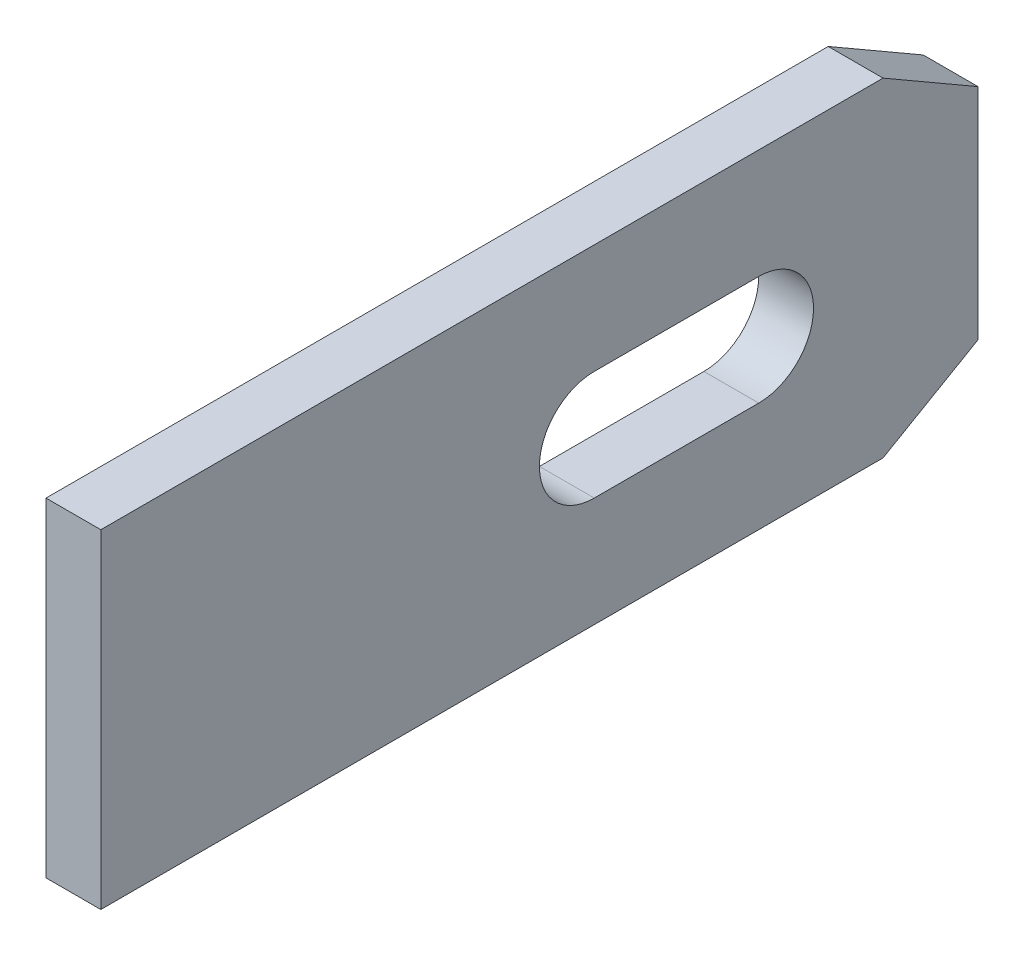
ISO-10303-21;
HEADER;
FILE_DESCRIPTION(('STEP AP214'),'2;1');
FILE_NAME('part.step','',(''),(''),'','','');
FILE_SCHEMA(('AUTOMOTIVE_DESIGN { 1 0 10303 214 1 1 1 1 }'));
ENDSEC;
DATA;
#1=APPLICATION_CONTEXT('core data for automotive mechanical design processes');
#2=APPLICATION_PROTOCOL_DEFINITION('international standard','automotive_design',2000,#1);
#3=PRODUCT_CONTEXT('',#1,'mechanical');
#4=PRODUCT('Part','Part','',(#3));
#5=PRODUCT_RELATED_PRODUCT_CATEGORY('part','',(#4));
#6=PRODUCT_DEFINITION_FORMATION('','',#4);
#7=PRODUCT_DEFINITION_CONTEXT('part definition',#1,'design');
#8=PRODUCT_DEFINITION('design','',#6,#7);
#9=PRODUCT_DEFINITION_SHAPE('','',#8);
#10=(LENGTH_UNIT() NAMED_UNIT(*) SI_UNIT(.MILLI.,.METRE.));
#11=(NAMED_UNIT(*) PLANE_ANGLE_UNIT() SI_UNIT($,.RADIAN.));
#12=(NAMED_UNIT(*) SI_UNIT($,.STERADIAN.) SOLID_ANGLE_UNIT());
#13=UNCERTAINTY_MEASURE_WITH_UNIT(LENGTH_MEASURE(1.E-05),#10,'distance_accuracy_value','');
#14=(GEOMETRIC_REPRESENTATION_CONTEXT(3) GLOBAL_UNCERTAINTY_ASSIGNED_CONTEXT((#13)) GLOBAL_UNIT_ASSIGNED_CONTEXT((#10,
#11,#12)) REPRESENTATION_CONTEXT('',''));
#15=CARTESIAN_POINT('',(0.,0.,0.));
#16=DIRECTION('',(0.,0.,1.));
#17=DIRECTION('',(1.,0.,0.));
#18=AXIS2_PLACEMENT_3D('',#15,#16,#17);
#19=CARTESIAN_POINT('',(0.25,0.,0.));
#20=DIRECTION('',(-1.,0.,0.));
#21=DIRECTION('',(0.,0.,1.));
#22=AXIS2_PLACEMENT_3D('',#19,#20,#21);
#23=PLANE('',#22);
#24=CARTESIAN_POINT('',(0.25,0.,-2.));
#25=DIRECTION('',(1.,0.,0.));
#26=DIRECTION('',(0.,1.,0.));
#27=AXIS2_PLACEMENT_3D('',#24,#25,#26);
#28=CIRCLE('',#27,0.5);
#29=CARTESIAN_POINT('',(0.25,-0.5,-2.));
#30=VERTEX_POINT('',#29);
#31=CARTESIAN_POINT('',(0.25,0.5,-2.));
#32=VERTEX_POINT('',#31);
#33=EDGE_CURVE('E124',#30,#32,#28,.T.);
#34=ORIENTED_EDGE('',*,*,#33,.F.);
#35=DIRECTION('',(0.,-1.04684779363235E-13,-1.));
#36=VECTOR('',#35,1.);
#37=CARTESIAN_POINT('',(0.25,-0.5,-2.));
#38=LINE('',#37,#36);
#39=CARTESIAN_POINT('',(0.25,-0.499999999999848,-0.49999999999456));
#40=VERTEX_POINT('',#39);
#41=EDGE_CURVE('E103',#40,#30,#38,.T.);
#42=ORIENTED_EDGE('',*,*,#41,.F.);
#43=CARTESIAN_POINT('',(0.25,3.88578058618805E-13,-0.49999999999939));
#44=DIRECTION('',(1.,0.,0.));
#45=DIRECTION('',(0.,-1.,9.67739777201872E-12));
#46=AXIS2_PLACEMENT_3D('',#43,#44,#45);
#47=CIRCLE('',#46,0.500000000000234);
#48=CARTESIAN_POINT('',(0.25,0.500000000000153,-0.499999999999279));
#49=VERTEX_POINT('',#48);
#50=EDGE_CURVE('E137',#49,#40,#47,.T.);
#51=ORIENTED_EDGE('',*,*,#50,.F.);
#52=DIRECTION('',(0.,1.04638520070869E-13,1.));
#53=VECTOR('',#52,1.);
#54=CARTESIAN_POINT('',(0.25,0.500000000000153,-0.499999999999279));
#55=LINE('',#54,#53);
#56=EDGE_CURVE('E120',#32,#49,#55,.T.);
#57=ORIENTED_EDGE('',*,*,#56,.F.);
#58=EDGE_LOOP('',(#34,#42,#51,#57));
#59=FACE_BOUND('',#58,.T.);
#60=DIRECTION('',(0.,0.,1.));
#61=VECTOR('',#60,1.);
#62=CARTESIAN_POINT('',(0.25,-1.5,-4.));
#63=LINE('',#62,#61);
#64=CARTESIAN_POINT('',(0.25,-1.5,-3.13397459621556));
#65=VERTEX_POINT('',#64);
#66=CARTESIAN_POINT('',(0.25,-1.5,4.));
#67=VERTEX_POINT('',#66);
#68=EDGE_CURVE('E11',#65,#67,#63,.T.);
#69=ORIENTED_EDGE('',*,*,#68,.F.);
#70=DIRECTION('',(0.,-0.5,0.866025403784439));
#71=VECTOR('',#70,1.);
#72=CARTESIAN_POINT('',(0.25,-1.5,-3.13397459621556));
#73=LINE('',#72,#71);
#74=CARTESIAN_POINT('',(0.25,-1.,-4.));
#75=VERTEX_POINT('',#74);
#76=EDGE_CURVE('E21',#75,#65,#73,.T.);
#77=ORIENTED_EDGE('',*,*,#76,.F.);
#78=DIRECTION('',(0.,-1.,0.));
#79=VECTOR('',#78,1.);
#80=CARTESIAN_POINT('',(0.25,1.5,-4.));
#81=LINE('',#80,#79);
#82=CARTESIAN_POINT('',(0.25,1.,-4.));
#83=VERTEX_POINT('',#82);
#84=EDGE_CURVE('E119',#83,#75,#81,.T.);
#85=ORIENTED_EDGE('',*,*,#84,.F.);
#86=DIRECTION('',(0.,-0.5,-0.866025403784439));
#87=VECTOR('',#86,1.);
#88=CARTESIAN_POINT('',(0.25,1.5,-3.13397459621556));
#89=LINE('',#88,#87);
#90=CARTESIAN_POINT('',(0.25,1.5,-3.13397459621556));
#91=VERTEX_POINT('',#90);
#92=EDGE_CURVE('E114',#91,#83,#89,.T.);
#93=ORIENTED_EDGE('',*,*,#92,.F.);
#94=DIRECTION('',(0.,0.,-1.));
#95=VECTOR('',#94,1.);
#96=CARTESIAN_POINT('',(0.25,1.5,4.));
#97=LINE('',#96,#95);
#98=CARTESIAN_POINT('',(0.25,1.5,4.));
#99=VERTEX_POINT('',#98);
#100=EDGE_CURVE('E70',#99,#91,#97,.T.);
#101=ORIENTED_EDGE('',*,*,#100,.F.);
#102=DIRECTION('',(0.,1.,0.));
#103=VECTOR('',#102,1.);
#104=CARTESIAN_POINT('',(0.25,-1.5,4.));
#105=LINE('',#104,#103);
#106=EDGE_CURVE('E28',#67,#99,#105,.T.);
#107=ORIENTED_EDGE('',*,*,#106,.F.);
#108=EDGE_LOOP('',(#69,#77,#85,#93,#101,#107));
#109=FACE_BOUND('',#108,.T.);
#110=ADVANCED_FACE('F17',(#59,#109),#23,.F.);
#111=CARTESIAN_POINT('',(0.,-1.5,-3.13397459621556));
#112=DIRECTION('',(0.,1.,0.));
#113=DIRECTION('',(1.,0.,0.));
#114=AXIS2_PLACEMENT_3D('',#111,#112,#113);
#115=PLANE('',#114);
#116=DIRECTION('',(1.,0.,0.));
#117=VECTOR('',#116,1.);
#118=CARTESIAN_POINT('',(0.,-1.5,4.));
#119=LINE('',#118,#117);
#120=CARTESIAN_POINT('',(-0.25,-1.5,4.));
#121=VERTEX_POINT('',#120);
#122=EDGE_CURVE('E63',#121,#67,#119,.T.);
#123=ORIENTED_EDGE('',*,*,#122,.F.);
#124=DIRECTION('',(0.,0.,-1.));
#125=VECTOR('',#124,1.);
#126=CARTESIAN_POINT('',(-0.25,-1.5,-4.));
#127=LINE('',#126,#125);
#128=CARTESIAN_POINT('',(-0.25,-1.5,-3.13397459621556));
#129=VERTEX_POINT('',#128);
#130=EDGE_CURVE('E67',#121,#129,#127,.T.);
#131=ORIENTED_EDGE('',*,*,#130,.T.);
#132=DIRECTION('',(-1.,0.,0.));
#133=VECTOR('',#132,1.);
#134=CARTESIAN_POINT('',(0.,-1.5,-3.13397459621556));
#135=LINE('',#134,#133);
#136=EDGE_CURVE('E147',#65,#129,#135,.T.);
#137=ORIENTED_EDGE('',*,*,#136,.F.);
#138=ORIENTED_EDGE('',*,*,#68,.T.);
#139=EDGE_LOOP('',(#123,#131,#137,#138));
#140=FACE_BOUND('',#139,.T.);
#141=ADVANCED_FACE('F65',(#140),#115,.F.);
#142=CARTESIAN_POINT('',(0.,-1.5,4.));
#143=DIRECTION('',(0.,0.,-1.));
#144=DIRECTION('',(0.,-1.,0.));
#145=AXIS2_PLACEMENT_3D('',#142,#143,#144);
#146=PLANE('',#145);
#147=DIRECTION('',(1.,0.,0.));
#148=VECTOR('',#147,1.);
#149=CARTESIAN_POINT('',(0.,1.5,4.));
#150=LINE('',#149,#148);
#151=CARTESIAN_POINT('',(-0.25,1.5,4.));
#152=VERTEX_POINT('',#151);
#153=EDGE_CURVE('E77',#152,#99,#150,.T.);
#154=ORIENTED_EDGE('',*,*,#153,.F.);
#155=DIRECTION('',(0.,-1.,0.));
#156=VECTOR('',#155,1.);
#157=CARTESIAN_POINT('',(-0.25,-1.5,4.));
#158=LINE('',#157,#156);
#159=EDGE_CURVE('E74',#152,#121,#158,.T.);
#160=ORIENTED_EDGE('',*,*,#159,.T.);
#161=ORIENTED_EDGE('',*,*,#122,.T.);
#162=ORIENTED_EDGE('',*,*,#106,.T.);
#163=EDGE_LOOP('',(#154,#160,#161,#162));
#164=FACE_BOUND('',#163,.T.);
#165=ADVANCED_FACE('F75',(#164),#146,.F.);
#166=CARTESIAN_POINT('',(0.,1.5,4.));
#167=DIRECTION('',(0.,-1.,0.));
#168=DIRECTION('',(0.,0.,-1.));
#169=AXIS2_PLACEMENT_3D('',#166,#167,#168);
#170=PLANE('',#169);
#171=DIRECTION('',(1.,0.,0.));
#172=VECTOR('',#171,1.);
#173=CARTESIAN_POINT('',(0.,1.5,-3.13397459621556));
#174=LINE('',#173,#172);
#175=CARTESIAN_POINT('',(-0.25,1.5,-3.13397459621556));
#176=VERTEX_POINT('',#175);
#177=EDGE_CURVE('E115',#176,#91,#174,.T.);
#178=ORIENTED_EDGE('',*,*,#177,.F.);
#179=DIRECTION('',(0.,0.,1.));
#180=VECTOR('',#179,1.);
#181=CARTESIAN_POINT('',(-0.25,1.5,4.));
#182=LINE('',#181,#180);
#183=EDGE_CURVE('E82',#176,#152,#182,.T.);
#184=ORIENTED_EDGE('',*,*,#183,.T.);
#185=ORIENTED_EDGE('',*,*,#153,.T.);
#186=ORIENTED_EDGE('',*,*,#100,.T.);
#187=EDGE_LOOP('',(#178,#184,#185,#186));
#188=FACE_BOUND('',#187,.T.);
#189=ADVANCED_FACE('F259',(#188),#170,.F.);
#190=CARTESIAN_POINT('',(0.,1.5,-3.13397459621556));
#191=DIRECTION('',(0.,-0.866025403784439,0.5));
#192=DIRECTION('',(-1.,0.,0.));
#193=AXIS2_PLACEMENT_3D('',#190,#191,#192);
#194=PLANE('',#193);
#195=DIRECTION('',(1.,0.,0.));
#196=VECTOR('',#195,1.);
#197=CARTESIAN_POINT('',(0.,1.,-4.));
#198=LINE('',#197,#196);
#199=CARTESIAN_POINT('',(-0.25,1.,-4.));
#200=VERTEX_POINT('',#199);
#201=EDGE_CURVE('E126',#200,#83,#198,.T.);
#202=ORIENTED_EDGE('',*,*,#201,.F.);
#203=DIRECTION('',(0.,0.5,0.866025403784439));
#204=VECTOR('',#203,1.);
#205=CARTESIAN_POINT('',(-0.25,1.5,-3.13397459621556));
#206=LINE('',#205,#204);
#207=EDGE_CURVE('E99',#200,#176,#206,.T.);
#208=ORIENTED_EDGE('',*,*,#207,.T.);
#209=ORIENTED_EDGE('',*,*,#177,.T.);
#210=ORIENTED_EDGE('',*,*,#92,.T.);
#211=EDGE_LOOP('',(#202,#208,#209,#210));
#212=FACE_BOUND('',#211,.T.);
#213=ADVANCED_FACE('F256',(#212),#194,.F.);
#214=CARTESIAN_POINT('',(0.,1.,-4.));
#215=DIRECTION('',(0.,0.,1.));
#216=DIRECTION('',(1.,0.,0.));
#217=AXIS2_PLACEMENT_3D('',#214,#215,#216);
#218=PLANE('',#217);
#219=DIRECTION('',(1.,0.,0.));
#220=VECTOR('',#219,1.);
#221=CARTESIAN_POINT('',(0.,-1.,-4.));
#222=LINE('',#221,#220);
#223=CARTESIAN_POINT('',(-0.25,-1.,-4.));
#224=VERTEX_POINT('',#223);
#225=EDGE_CURVE('E160',#224,#75,#222,.T.);
#226=ORIENTED_EDGE('',*,*,#225,.F.);
#227=DIRECTION('',(0.,1.,0.));
#228=VECTOR('',#227,1.);
#229=CARTESIAN_POINT('',(-0.25,1.5,-4.));
#230=LINE('',#229,#228);
#231=EDGE_CURVE('E130',#224,#200,#230,.T.);
#232=ORIENTED_EDGE('',*,*,#231,.T.);
#233=ORIENTED_EDGE('',*,*,#201,.T.);
#234=ORIENTED_EDGE('',*,*,#84,.T.);
#235=EDGE_LOOP('',(#226,#232,#233,#234));
#236=FACE_BOUND('',#235,.T.);
#237=ADVANCED_FACE('F269',(#236),#218,.F.);
#238=CARTESIAN_POINT('',(0.,-1.,-4.));
#239=DIRECTION('',(0.,0.866025403784439,0.5));
#240=DIRECTION('',(1.,0.,0.));
#241=AXIS2_PLACEMENT_3D('',#238,#239,#240);
#242=PLANE('',#241);
#243=ORIENTED_EDGE('',*,*,#136,.T.);
#244=DIRECTION('',(0.,0.5,-0.866025403784439));
#245=VECTOR('',#244,1.);
#246=CARTESIAN_POINT('',(-0.25,-1.5,-3.13397459621556));
#247=LINE('',#246,#245);
#248=EDGE_CURVE('E87',#129,#224,#247,.T.);
#249=ORIENTED_EDGE('',*,*,#248,.T.);
#250=ORIENTED_EDGE('',*,*,#225,.T.);
#251=ORIENTED_EDGE('',*,*,#76,.T.);
#252=EDGE_LOOP('',(#243,#249,#250,#251));
#253=FACE_BOUND('',#252,.T.);
#254=ADVANCED_FACE('F271',(#253),#242,.F.);
#255=CARTESIAN_POINT('',(0.,0.,-2.));
#256=DIRECTION('',(-1.,0.,0.));
#257=DIRECTION('',(0.,1.,0.));
#258=AXIS2_PLACEMENT_3D('',#255,#256,#257);
#259=CYLINDRICAL_SURFACE('',#258,0.5);
#260=DIRECTION('',(1.,0.,0.));
#261=VECTOR('',#260,1.);
#262=CARTESIAN_POINT('',(0.,0.5,-2.));
#263=LINE('',#262,#261);
#264=CARTESIAN_POINT('',(-0.25,0.5,-2.));
#265=VERTEX_POINT('',#264);
#266=EDGE_CURVE('E125',#265,#32,#263,.T.);
#267=ORIENTED_EDGE('',*,*,#266,.F.);
#268=CARTESIAN_POINT('',(-0.25,0.,-2.));
#269=DIRECTION('',(-1.,0.,0.));
#270=DIRECTION('',(0.,1.,0.));
#271=AXIS2_PLACEMENT_3D('',#268,#269,#270);
#272=CIRCLE('',#271,0.5);
#273=CARTESIAN_POINT('',(-0.25,-0.5,-2.));
#274=VERTEX_POINT('',#273);
#275=EDGE_CURVE('E141',#265,#274,#272,.T.);
#276=ORIENTED_EDGE('',*,*,#275,.T.);
#277=DIRECTION('',(-1.,0.,0.));
#278=VECTOR('',#277,1.);
#279=CARTESIAN_POINT('',(0.,-0.5,-2.));
#280=LINE('',#279,#278);
#281=EDGE_CURVE('E104',#30,#274,#280,.T.);
#282=ORIENTED_EDGE('',*,*,#281,.F.);
#283=ORIENTED_EDGE('',*,*,#33,.T.);
#284=EDGE_LOOP('',(#267,#276,#282,#283));
#285=FACE_BOUND('',#284,.T.);
#286=ADVANCED_FACE('F241',(#285),#259,.F.);
#287=CARTESIAN_POINT('',(0.,0.5,-2.));
#288=DIRECTION('',(0.,1.,-1.04638520070869E-13));
#289=DIRECTION('',(0.,-1.04638520070869E-13,-1.));
#290=AXIS2_PLACEMENT_3D('',#287,#288,#289);
#291=PLANE('',#290);
#292=DIRECTION('',(1.,0.,0.));
#293=VECTOR('',#292,1.);
#294=CARTESIAN_POINT('',(0.,0.500000000000153,-0.499999999999279));
#295=LINE('',#294,#293);
#296=CARTESIAN_POINT('',(-0.25,0.500000000000153,-0.499999999999279));
#297=VERTEX_POINT('',#296);
#298=EDGE_CURVE('E95',#297,#49,#295,.T.);
#299=ORIENTED_EDGE('',*,*,#298,.F.);
#300=DIRECTION('',(0.,-1.04638520070869E-13,-1.));
#301=VECTOR('',#300,1.);
#302=CARTESIAN_POINT('',(-0.25,0.500000000000153,-0.499999999999279));
#303=LINE('',#302,#301);
#304=EDGE_CURVE('E111',#297,#265,#303,.T.);
#305=ORIENTED_EDGE('',*,*,#304,.T.);
#306=ORIENTED_EDGE('',*,*,#266,.T.);
#307=ORIENTED_EDGE('',*,*,#56,.T.);
#308=EDGE_LOOP('',(#299,#305,#306,#307));
#309=FACE_BOUND('',#308,.T.);
#310=ADVANCED_FACE('F194',(#309),#291,.F.);
#311=CARTESIAN_POINT('',(0.,3.88578058618805E-13,-0.49999999999939));
#312=DIRECTION('',(-1.,0.,0.));
#313=DIRECTION('',(0.,-1.,9.67739777201872E-12));
#314=AXIS2_PLACEMENT_3D('',#311,#312,#313);
#315=CYLINDRICAL_SURFACE('',#314,0.500000000000234);
#316=DIRECTION('',(1.,0.,0.));
#317=VECTOR('',#316,1.);
#318=CARTESIAN_POINT('',(0.,-0.499999999999848,-0.49999999999456));
#319=LINE('',#318,#317);
#320=CARTESIAN_POINT('',(-0.25,-0.499999999999848,-0.49999999999456));
#321=VERTEX_POINT('',#320);
#322=EDGE_CURVE('E100',#321,#40,#319,.T.);
#323=ORIENTED_EDGE('',*,*,#322,.F.);
#324=CARTESIAN_POINT('',(-0.25,3.88578058618805E-13,-0.49999999999939));
#325=DIRECTION('',(-1.,0.,0.));
#326=DIRECTION('',(0.,-1.,9.67739777201872E-12));
#327=AXIS2_PLACEMENT_3D('',#324,#325,#326);
#328=CIRCLE('',#327,0.500000000000234);
#329=EDGE_CURVE('E106',#321,#297,#328,.T.);
#330=ORIENTED_EDGE('',*,*,#329,.T.);
#331=ORIENTED_EDGE('',*,*,#298,.T.);
#332=ORIENTED_EDGE('',*,*,#50,.T.);
#333=EDGE_LOOP('',(#323,#330,#331,#332));
#334=FACE_BOUND('',#333,.T.);
#335=ADVANCED_FACE('F187',(#334),#315,.F.);
#336=CARTESIAN_POINT('',(0.,-0.499999999999848,-0.49999999999456));
#337=DIRECTION('',(0.,-1.,1.04684779363235E-13));
#338=DIRECTION('',(-1.,0.,0.));
#339=AXIS2_PLACEMENT_3D('',#336,#337,#338);
#340=PLANE('',#339);
#341=ORIENTED_EDGE('',*,*,#281,.T.);
#342=DIRECTION('',(0.,1.04684779363235E-13,1.));
#343=VECTOR('',#342,1.);
#344=CARTESIAN_POINT('',(-0.25,-0.5,-2.));
#345=LINE('',#344,#343);
#346=EDGE_CURVE('E110',#274,#321,#345,.T.);
#347=ORIENTED_EDGE('',*,*,#346,.T.);
#348=ORIENTED_EDGE('',*,*,#322,.T.);
#349=ORIENTED_EDGE('',*,*,#41,.T.);
#350=EDGE_LOOP('',(#341,#347,#348,#349));
#351=FACE_BOUND('',#350,.T.);
#352=ADVANCED_FACE('F244',(#351),#340,.F.);
#353=CARTESIAN_POINT('',(-0.25,0.,0.));
#354=DIRECTION('',(-1.,0.,0.));
#355=DIRECTION('',(0.,0.,1.));
#356=AXIS2_PLACEMENT_3D('',#353,#354,#355);
#357=PLANE('',#356);
#358=ORIENTED_EDGE('',*,*,#275,.F.);
#359=ORIENTED_EDGE('',*,*,#304,.F.);
#360=ORIENTED_EDGE('',*,*,#329,.F.);
#361=ORIENTED_EDGE('',*,*,#346,.F.);
#362=EDGE_LOOP('',(#358,#359,#360,#361));
#363=FACE_BOUND('',#362,.T.);
#364=ORIENTED_EDGE('',*,*,#130,.F.);
#365=ORIENTED_EDGE('',*,*,#159,.F.);
#366=ORIENTED_EDGE('',*,*,#183,.F.);
#367=ORIENTED_EDGE('',*,*,#207,.F.);
#368=ORIENTED_EDGE('',*,*,#231,.F.);
#369=ORIENTED_EDGE('',*,*,#248,.F.);
#370=EDGE_LOOP('',(#364,#365,#366,#367,#368,#369));
#371=FACE_BOUND('',#370,.T.);
#372=ADVANCED_FACE('F19',(#363,#371),#357,.T.);
#373=CLOSED_SHELL('',(#110,#141,#165,#189,#213,#237,#254,#286,#310,#335,#352,#372));
#374=MANIFOLD_SOLID_BREP('B1',#373);
#375=ADVANCED_BREP_SHAPE_REPRESENTATION('',(#18,#374),#14);
#376=SHAPE_DEFINITION_REPRESENTATION(#9,#375);
ENDSEC;
END-ISO-10303-21;
